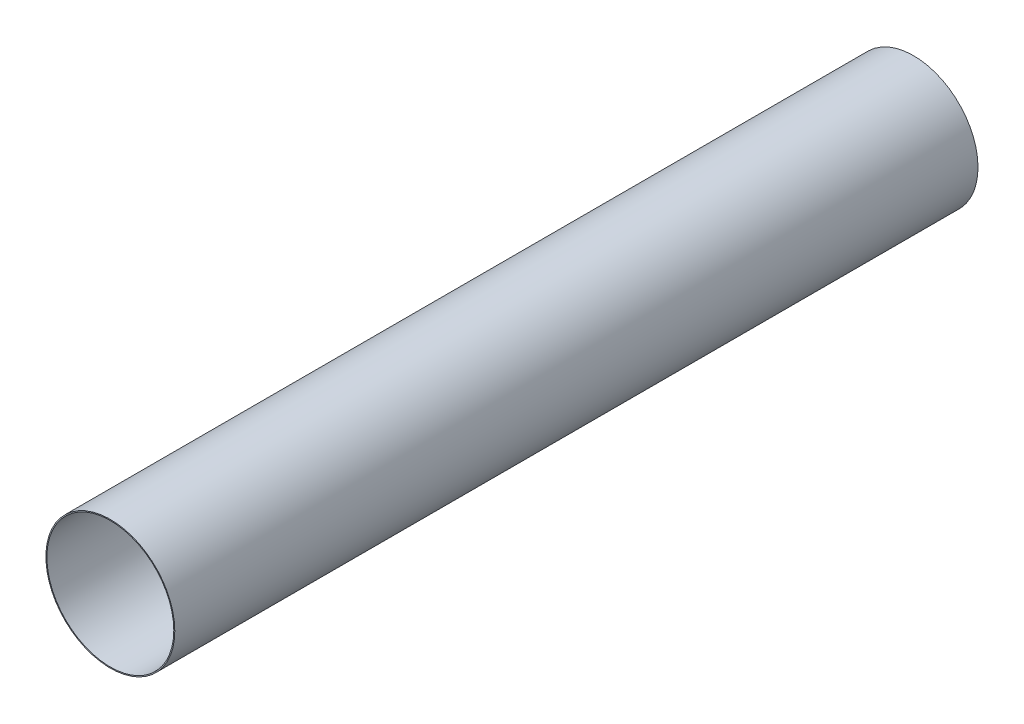
ISO-10303-21;
HEADER;
FILE_DESCRIPTION(('STEP AP214'),'2;1');
FILE_NAME('part.step','',(''),(''),'','','');
FILE_SCHEMA(('AUTOMOTIVE_DESIGN { 1 0 10303 214 1 1 1 1 }'));
ENDSEC;
DATA;
#1=APPLICATION_CONTEXT('core data for automotive mechanical design processes');
#2=APPLICATION_PROTOCOL_DEFINITION('international standard','automotive_design',2000,#1);
#3=PRODUCT_CONTEXT('',#1,'mechanical');
#4=PRODUCT('Part','Part','',(#3));
#5=PRODUCT_RELATED_PRODUCT_CATEGORY('part','',(#4));
#6=PRODUCT_DEFINITION_FORMATION('','',#4);
#7=PRODUCT_DEFINITION_CONTEXT('part definition',#1,'design');
#8=PRODUCT_DEFINITION('design','',#6,#7);
#9=PRODUCT_DEFINITION_SHAPE('','',#8);
#10=(LENGTH_UNIT() NAMED_UNIT(*) SI_UNIT(.MILLI.,.METRE.));
#11=(NAMED_UNIT(*) PLANE_ANGLE_UNIT() SI_UNIT($,.RADIAN.));
#12=(NAMED_UNIT(*) SI_UNIT($,.STERADIAN.) SOLID_ANGLE_UNIT());
#13=UNCERTAINTY_MEASURE_WITH_UNIT(LENGTH_MEASURE(1.E-05),#10,'distance_accuracy_value','');
#14=(GEOMETRIC_REPRESENTATION_CONTEXT(3) GLOBAL_UNCERTAINTY_ASSIGNED_CONTEXT((#13)) GLOBAL_UNIT_ASSIGNED_CONTEXT((#10,
#11,#12)) REPRESENTATION_CONTEXT('',''));
#15=CARTESIAN_POINT('',(0.,0.,0.));
#16=DIRECTION('',(0.,0.,1.));
#17=DIRECTION('',(1.,0.,0.));
#18=AXIS2_PLACEMENT_3D('',#15,#16,#17);
#19=CARTESIAN_POINT('',(0.,0.,949.3));
#20=DIRECTION('',(0.,0.,1.));
#21=DIRECTION('',(1.,0.,0.));
#22=AXIS2_PLACEMENT_3D('',#19,#20,#21);
#23=PLANE('',#22);
#24=CARTESIAN_POINT('',(0.,0.,949.3));
#25=DIRECTION('',(0.,0.,1.));
#26=DIRECTION('',(1.,0.,0.));
#27=AXIS2_PLACEMENT_3D('',#24,#25,#26);
#28=CIRCLE('',#27,76.182);
#29=CARTESIAN_POINT('',(76.182,0.,949.3));
#30=VERTEX_POINT('',#29);
#31=EDGE_CURVE('E11',#30,#30,#28,.T.);
#32=ORIENTED_EDGE('',*,*,#31,.T.);
#33=EDGE_LOOP('',(#32));
#34=FACE_BOUND('',#33,.T.);
#35=CARTESIAN_POINT('',(0.,0.,949.3));
#36=DIRECTION('',(0.,0.,1.));
#37=DIRECTION('',(1.,0.,0.));
#38=AXIS2_PLACEMENT_3D('',#35,#36,#37);
#39=CIRCLE('',#38,75.);
#40=CARTESIAN_POINT('',(75.,0.,949.3));
#41=VERTEX_POINT('',#40);
#42=EDGE_CURVE('E53',#41,#41,#39,.T.);
#43=ORIENTED_EDGE('',*,*,#42,.F.);
#44=EDGE_LOOP('',(#43));
#45=FACE_BOUND('',#44,.T.);
#46=ADVANCED_FACE('F41',(#34,#45),#23,.T.);
#47=CARTESIAN_POINT('',(0.,0.,0.));
#48=DIRECTION('',(0.,0.,1.));
#49=DIRECTION('',(1.,0.,0.));
#50=AXIS2_PLACEMENT_3D('',#47,#48,#49);
#51=PLANE('',#50);
#52=CARTESIAN_POINT('',(0.,0.,0.));
#53=DIRECTION('',(0.,0.,1.));
#54=DIRECTION('',(1.,0.,0.));
#55=AXIS2_PLACEMENT_3D('',#52,#53,#54);
#56=CIRCLE('',#55,76.182);
#57=CARTESIAN_POINT('',(76.182,0.,0.));
#58=VERTEX_POINT('',#57);
#59=EDGE_CURVE('E45',#58,#58,#56,.T.);
#60=ORIENTED_EDGE('',*,*,#59,.F.);
#61=EDGE_LOOP('',(#60));
#62=FACE_BOUND('',#61,.T.);
#63=CARTESIAN_POINT('',(0.,0.,0.));
#64=DIRECTION('',(0.,0.,1.));
#65=DIRECTION('',(1.,0.,0.));
#66=AXIS2_PLACEMENT_3D('',#63,#64,#65);
#67=CIRCLE('',#66,75.);
#68=CARTESIAN_POINT('',(75.,0.,0.));
#69=VERTEX_POINT('',#68);
#70=EDGE_CURVE('E55',#69,#69,#67,.T.);
#71=ORIENTED_EDGE('',*,*,#70,.T.);
#72=EDGE_LOOP('',(#71));
#73=FACE_BOUND('',#72,.T.);
#74=ADVANCED_FACE('F66',(#62,#73),#51,.F.);
#75=CARTESIAN_POINT('',(0.,0.,949.3));
#76=DIRECTION('',(0.,0.,-1.));
#77=DIRECTION('',(-1.,0.,0.));
#78=AXIS2_PLACEMENT_3D('',#75,#76,#77);
#79=CYLINDRICAL_SURFACE('',#78,76.182);
#80=ORIENTED_EDGE('',*,*,#31,.F.);
#81=EDGE_LOOP('',(#80));
#82=FACE_BOUND('',#81,.T.);
#83=ORIENTED_EDGE('',*,*,#59,.T.);
#84=EDGE_LOOP('',(#83));
#85=FACE_BOUND('',#84,.T.);
#86=ADVANCED_FACE('F43',(#82,#85),#79,.T.);
#87=CARTESIAN_POINT('',(0.,0.,949.3));
#88=DIRECTION('',(0.,0.,-1.));
#89=DIRECTION('',(-1.,0.,0.));
#90=AXIS2_PLACEMENT_3D('',#87,#88,#89);
#91=CYLINDRICAL_SURFACE('',#90,75.);
#92=ORIENTED_EDGE('',*,*,#42,.T.);
#93=EDGE_LOOP('',(#92));
#94=FACE_BOUND('',#93,.T.);
#95=ORIENTED_EDGE('',*,*,#70,.F.);
#96=EDGE_LOOP('',(#95));
#97=FACE_BOUND('',#96,.T.);
#98=ADVANCED_FACE('F62',(#94,#97),#91,.F.);
#99=CLOSED_SHELL('',(#46,#74,#86,#98));
#100=MANIFOLD_SOLID_BREP('B2',#99);
#101=ADVANCED_BREP_SHAPE_REPRESENTATION('',(#18,#100),#14);
#102=SHAPE_DEFINITION_REPRESENTATION(#9,#101);
ENDSEC;
END-ISO-10303-21;
